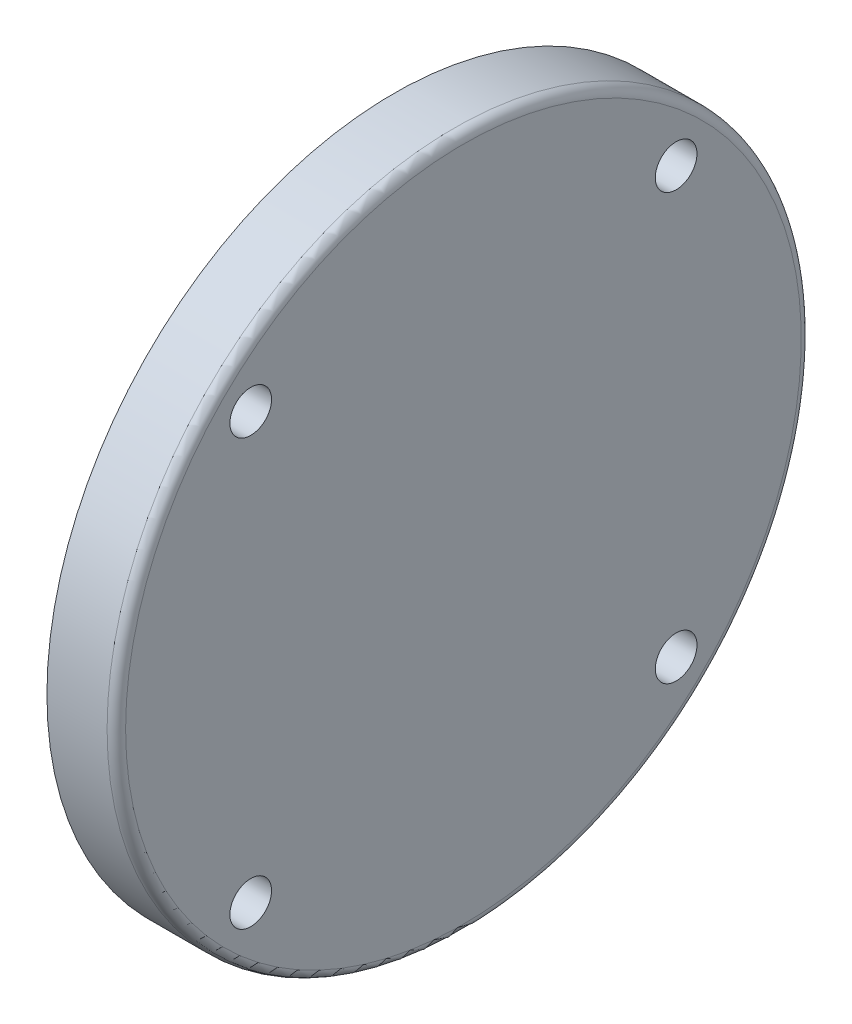
ISO-10303-21;
HEADER;
FILE_DESCRIPTION(('STEP AP214'),'2;1');
FILE_NAME('part.step','',(''),(''),'','','');
FILE_SCHEMA(('AUTOMOTIVE_DESIGN { 1 0 10303 214 1 1 1 1 }'));
ENDSEC;
DATA;
#1=APPLICATION_CONTEXT('core data for automotive mechanical design processes');
#2=APPLICATION_PROTOCOL_DEFINITION('international standard','automotive_design',2000,#1);
#3=PRODUCT_CONTEXT('',#1,'mechanical');
#4=PRODUCT('Part','Part','',(#3));
#5=PRODUCT_RELATED_PRODUCT_CATEGORY('part','',(#4));
#6=PRODUCT_DEFINITION_FORMATION('','',#4);
#7=PRODUCT_DEFINITION_CONTEXT('part definition',#1,'design');
#8=PRODUCT_DEFINITION('design','',#6,#7);
#9=PRODUCT_DEFINITION_SHAPE('','',#8);
#10=(LENGTH_UNIT() NAMED_UNIT(*) SI_UNIT(.MILLI.,.METRE.));
#11=(NAMED_UNIT(*) PLANE_ANGLE_UNIT() SI_UNIT($,.RADIAN.));
#12=(NAMED_UNIT(*) SI_UNIT($,.STERADIAN.) SOLID_ANGLE_UNIT());
#13=UNCERTAINTY_MEASURE_WITH_UNIT(LENGTH_MEASURE(1.E-05),#10,'distance_accuracy_value','');
#14=(GEOMETRIC_REPRESENTATION_CONTEXT(3) GLOBAL_UNCERTAINTY_ASSIGNED_CONTEXT((#13)) GLOBAL_UNIT_ASSIGNED_CONTEXT((#10,
#11,#12)) REPRESENTATION_CONTEXT('',''));
#15=CARTESIAN_POINT('',(0.,0.,0.));
#16=DIRECTION('',(0.,0.,1.));
#17=DIRECTION('',(1.,0.,0.));
#18=AXIS2_PLACEMENT_3D('',#15,#16,#17);
#19=CARTESIAN_POINT('',(13.,0.,0.));
#20=DIRECTION('',(1.,0.,0.));
#21=DIRECTION('',(0.,0.,-1.));
#22=AXIS2_PLACEMENT_3D('',#19,#20,#21);
#23=TOROIDAL_SURFACE('',#22,73.,2.);
#24=CARTESIAN_POINT('',(15.,0.,0.));
#25=DIRECTION('',(1.,0.,0.));
#26=DIRECTION('',(0.,0.,-1.));
#27=AXIS2_PLACEMENT_3D('',#24,#25,#26);
#28=CIRCLE('',#27,73.);
#29=CARTESIAN_POINT('',(15.,0.,73.));
#30=VERTEX_POINT('',#29);
#31=EDGE_CURVE('E136',#30,#30,#28,.T.);
#32=ORIENTED_EDGE('',*,*,#31,.F.);
#33=CARTESIAN_POINT('',(13.,0.,73.));
#34=DIRECTION('',(0.,-1.,0.));
#35=DIRECTION('',(0.,0.,1.));
#36=AXIS2_PLACEMENT_3D('',#33,#34,#35);
#37=CIRCLE('',#36,2.);
#38=CARTESIAN_POINT('',(13.,0.,75.));
#39=VERTEX_POINT('',#38);
#40=EDGE_CURVE('E11',#30,#39,#37,.T.);
#41=ORIENTED_EDGE('',*,*,#40,.T.);
#42=CARTESIAN_POINT('',(13.,0.,0.));
#43=DIRECTION('',(-1.,0.,0.));
#44=DIRECTION('',(0.,0.,-1.));
#45=AXIS2_PLACEMENT_3D('',#42,#43,#44);
#46=CIRCLE('',#45,75.);
#47=CARTESIAN_POINT('',(13.,0.,-75.));
#48=VERTEX_POINT('',#47);
#49=EDGE_CURVE('E126',#48,#39,#46,.T.);
#50=ORIENTED_EDGE('',*,*,#49,.F.);
#51=CARTESIAN_POINT('',(13.,0.,0.));
#52=DIRECTION('',(-1.,0.,0.));
#53=DIRECTION('',(0.,0.,-1.));
#54=AXIS2_PLACEMENT_3D('',#51,#52,#53);
#55=CIRCLE('',#54,75.);
#56=EDGE_CURVE('E121',#39,#48,#55,.T.);
#57=ORIENTED_EDGE('',*,*,#56,.F.);
#58=ORIENTED_EDGE('',*,*,#40,.F.);
#59=EDGE_LOOP('',(#32,#41,#50,#57,#58));
#60=FACE_BOUND('',#59,.T.);
#61=ADVANCED_FACE('F16',(#60),#23,.T.);
#62=CARTESIAN_POINT('',(0.,0.,0.));
#63=DIRECTION('',(1.,0.,0.));
#64=DIRECTION('',(0.,0.,-1.));
#65=AXIS2_PLACEMENT_3D('',#62,#63,#64);
#66=TOROIDAL_SURFACE('',#65,50.,5.);
#67=CARTESIAN_POINT('',(0.,0.,0.));
#68=DIRECTION('',(1.,0.,0.));
#69=DIRECTION('',(0.,0.,-1.));
#70=AXIS2_PLACEMENT_3D('',#67,#68,#69);
#71=CIRCLE('',#70,55.);
#72=CARTESIAN_POINT('',(0.,0.,55.));
#73=VERTEX_POINT('',#72);
#74=EDGE_CURVE('E148',#73,#73,#71,.T.);
#75=ORIENTED_EDGE('',*,*,#74,.F.);
#76=CARTESIAN_POINT('',(0.,0.,50.));
#77=DIRECTION('',(0.,1.,0.));
#78=DIRECTION('',(0.,0.,1.));
#79=AXIS2_PLACEMENT_3D('',#76,#77,#78);
#80=CIRCLE('',#79,5.);
#81=CARTESIAN_POINT('',(5.,0.,50.));
#82=VERTEX_POINT('',#81);
#83=EDGE_CURVE('E27',#73,#82,#80,.T.);
#84=ORIENTED_EDGE('',*,*,#83,.T.);
#85=CARTESIAN_POINT('',(5.,0.,0.));
#86=DIRECTION('',(-1.,0.,0.));
#87=DIRECTION('',(0.,0.,-1.));
#88=AXIS2_PLACEMENT_3D('',#85,#86,#87);
#89=CIRCLE('',#88,50.);
#90=EDGE_CURVE('E145',#82,#82,#89,.T.);
#91=ORIENTED_EDGE('',*,*,#90,.F.);
#92=ORIENTED_EDGE('',*,*,#83,.F.);
#93=EDGE_LOOP('',(#75,#84,#91,#92));
#94=FACE_BOUND('',#93,.T.);
#95=ADVANCED_FACE('F190',(#94),#66,.F.);
#96=CARTESIAN_POINT('',(15.,45.9619407771256,-45.9619407771256));
#97=DIRECTION('',(-1.,0.,0.));
#98=DIRECTION('',(0.,0.,1.));
#99=AXIS2_PLACEMENT_3D('',#96,#97,#98);
#100=CYLINDRICAL_SURFACE('',#99,4.5);
#101=CARTESIAN_POINT('',(15.,45.9619407771256,-45.9619407771256));
#102=DIRECTION('',(-1.,0.,0.));
#103=DIRECTION('',(0.,0.,1.));
#104=AXIS2_PLACEMENT_3D('',#101,#102,#103);
#105=CIRCLE('',#104,4.5);
#106=CARTESIAN_POINT('',(15.,45.9619407771256,-50.4619407771256));
#107=VERTEX_POINT('',#106);
#108=EDGE_CURVE('E131',#107,#107,#105,.T.);
#109=ORIENTED_EDGE('',*,*,#108,.F.);
#110=DIRECTION('',(-1.,0.,0.));
#111=VECTOR('',#110,1.);
#112=CARTESIAN_POINT('',(15.,45.9619407771256,-50.4619407771256));
#113=LINE('',#112,#111);
#114=CARTESIAN_POINT('',(0.,45.9619407771256,-50.4619407771256));
#115=VERTEX_POINT('',#114);
#116=EDGE_CURVE('E114',#107,#115,#113,.T.);
#117=ORIENTED_EDGE('',*,*,#116,.T.);
#118=CARTESIAN_POINT('',(0.,45.9619407771256,-45.9619407771256));
#119=DIRECTION('',(-1.,0.,0.));
#120=DIRECTION('',(0.,0.,-1.));
#121=AXIS2_PLACEMENT_3D('',#118,#119,#120);
#122=CIRCLE('',#121,4.5);
#123=EDGE_CURVE('E139',#115,#115,#122,.T.);
#124=ORIENTED_EDGE('',*,*,#123,.T.);
#125=ORIENTED_EDGE('',*,*,#116,.F.);
#126=EDGE_LOOP('',(#109,#117,#124,#125));
#127=FACE_BOUND('',#126,.T.);
#128=ADVANCED_FACE('F18',(#127),#100,.F.);
#129=CARTESIAN_POINT('',(15.,45.9619407771256,45.9619407771256));
#130=DIRECTION('',(-1.,0.,0.));
#131=DIRECTION('',(0.,0.,1.));
#132=AXIS2_PLACEMENT_3D('',#129,#130,#131);
#133=CYLINDRICAL_SURFACE('',#132,4.5);
#134=CARTESIAN_POINT('',(15.,45.9619407771256,45.9619407771256));
#135=DIRECTION('',(-1.,0.,0.));
#136=DIRECTION('',(0.,0.,1.));
#137=AXIS2_PLACEMENT_3D('',#134,#135,#136);
#138=CIRCLE('',#137,4.5);
#139=CARTESIAN_POINT('',(15.,45.9619407771256,41.4619407771256));
#140=VERTEX_POINT('',#139);
#141=EDGE_CURVE('E135',#140,#140,#138,.T.);
#142=ORIENTED_EDGE('',*,*,#141,.F.);
#143=DIRECTION('',(-1.,0.,0.));
#144=VECTOR('',#143,1.);
#145=CARTESIAN_POINT('',(15.,45.9619407771256,41.4619407771256));
#146=LINE('',#145,#144);
#147=CARTESIAN_POINT('',(0.,45.9619407771256,41.4619407771256));
#148=VERTEX_POINT('',#147);
#149=EDGE_CURVE('E108',#140,#148,#146,.T.);
#150=ORIENTED_EDGE('',*,*,#149,.T.);
#151=CARTESIAN_POINT('',(0.,45.9619407771256,45.9619407771256));
#152=DIRECTION('',(-1.,0.,0.));
#153=DIRECTION('',(0.,0.,-1.));
#154=AXIS2_PLACEMENT_3D('',#151,#152,#153);
#155=CIRCLE('',#154,4.5);
#156=EDGE_CURVE('E123',#148,#148,#155,.T.);
#157=ORIENTED_EDGE('',*,*,#156,.T.);
#158=ORIENTED_EDGE('',*,*,#149,.F.);
#159=EDGE_LOOP('',(#142,#150,#157,#158));
#160=FACE_BOUND('',#159,.T.);
#161=ADVANCED_FACE('F198',(#160),#133,.F.);
#162=CARTESIAN_POINT('',(15.,-45.9619407771256,45.9619407771256));
#163=DIRECTION('',(-1.,0.,0.));
#164=DIRECTION('',(0.,0.,1.));
#165=AXIS2_PLACEMENT_3D('',#162,#163,#164);
#166=CYLINDRICAL_SURFACE('',#165,4.5);
#167=CARTESIAN_POINT('',(15.,-45.9619407771256,45.9619407771256));
#168=DIRECTION('',(-1.,0.,0.));
#169=DIRECTION('',(0.,0.,1.));
#170=AXIS2_PLACEMENT_3D('',#167,#168,#169);
#171=CIRCLE('',#170,4.5);
#172=CARTESIAN_POINT('',(15.,-45.9619407771256,41.4619407771256));
#173=VERTEX_POINT('',#172);
#174=EDGE_CURVE('E106',#173,#173,#171,.T.);
#175=ORIENTED_EDGE('',*,*,#174,.F.);
#176=DIRECTION('',(-1.,0.,0.));
#177=VECTOR('',#176,1.);
#178=CARTESIAN_POINT('',(15.,-45.9619407771256,41.4619407771256));
#179=LINE('',#178,#177);
#180=CARTESIAN_POINT('',(0.,-45.9619407771256,41.4619407771256));
#181=VERTEX_POINT('',#180);
#182=EDGE_CURVE('E101',#173,#181,#179,.T.);
#183=ORIENTED_EDGE('',*,*,#182,.T.);
#184=CARTESIAN_POINT('',(0.,-45.9619407771256,45.9619407771256));
#185=DIRECTION('',(-1.,0.,0.));
#186=DIRECTION('',(0.,0.,-1.));
#187=AXIS2_PLACEMENT_3D('',#184,#185,#186);
#188=CIRCLE('',#187,4.5);
#189=EDGE_CURVE('E104',#181,#181,#188,.T.);
#190=ORIENTED_EDGE('',*,*,#189,.T.);
#191=ORIENTED_EDGE('',*,*,#182,.F.);
#192=EDGE_LOOP('',(#175,#183,#190,#191));
#193=FACE_BOUND('',#192,.T.);
#194=ADVANCED_FACE('F102',(#193),#166,.F.);
#195=CARTESIAN_POINT('',(15.,-45.9619407771256,-45.9619407771256));
#196=DIRECTION('',(-1.,0.,0.));
#197=DIRECTION('',(0.,0.,1.));
#198=AXIS2_PLACEMENT_3D('',#195,#196,#197);
#199=CYLINDRICAL_SURFACE('',#198,4.5);
#200=CARTESIAN_POINT('',(15.,-45.9619407771256,-45.9619407771256));
#201=DIRECTION('',(-1.,0.,0.));
#202=DIRECTION('',(0.,0.,1.));
#203=AXIS2_PLACEMENT_3D('',#200,#201,#202);
#204=CIRCLE('',#203,4.5);
#205=CARTESIAN_POINT('',(15.,-45.9619407771256,-50.4619407771256));
#206=VERTEX_POINT('',#205);
#207=EDGE_CURVE('E117',#206,#206,#204,.T.);
#208=ORIENTED_EDGE('',*,*,#207,.F.);
#209=DIRECTION('',(-1.,0.,0.));
#210=VECTOR('',#209,1.);
#211=CARTESIAN_POINT('',(15.,-45.9619407771256,-50.4619407771256));
#212=LINE('',#211,#210);
#213=CARTESIAN_POINT('',(0.,-45.9619407771256,-50.4619407771256));
#214=VERTEX_POINT('',#213);
#215=EDGE_CURVE('E41',#206,#214,#212,.T.);
#216=ORIENTED_EDGE('',*,*,#215,.T.);
#217=CARTESIAN_POINT('',(0.,-45.9619407771256,-45.9619407771256));
#218=DIRECTION('',(-1.,0.,0.));
#219=DIRECTION('',(0.,0.,-1.));
#220=AXIS2_PLACEMENT_3D('',#217,#218,#219);
#221=CIRCLE('',#220,4.5);
#222=EDGE_CURVE('E20',#214,#214,#221,.T.);
#223=ORIENTED_EDGE('',*,*,#222,.T.);
#224=ORIENTED_EDGE('',*,*,#215,.F.);
#225=EDGE_LOOP('',(#208,#216,#223,#224));
#226=FACE_BOUND('',#225,.T.);
#227=ADVANCED_FACE('F201',(#226),#199,.F.);
#228=CARTESIAN_POINT('',(15.,0.,0.));
#229=DIRECTION('',(1.,0.,0.));
#230=DIRECTION('',(0.,1.,0.));
#231=AXIS2_PLACEMENT_3D('',#228,#229,#230);
#232=PLANE('',#231);
#233=ORIENTED_EDGE('',*,*,#207,.T.);
#234=EDGE_LOOP('',(#233));
#235=FACE_BOUND('',#234,.T.);
#236=ORIENTED_EDGE('',*,*,#174,.T.);
#237=EDGE_LOOP('',(#236));
#238=FACE_BOUND('',#237,.T.);
#239=ORIENTED_EDGE('',*,*,#141,.T.);
#240=EDGE_LOOP('',(#239));
#241=FACE_BOUND('',#240,.T.);
#242=ORIENTED_EDGE('',*,*,#108,.T.);
#243=EDGE_LOOP('',(#242));
#244=FACE_BOUND('',#243,.T.);
#245=ORIENTED_EDGE('',*,*,#31,.T.);
#246=EDGE_LOOP('',(#245));
#247=FACE_BOUND('',#246,.T.);
#248=ADVANCED_FACE('F170',(#235,#238,#241,#244,#247),#232,.T.);
#249=CARTESIAN_POINT('',(5.,0.,0.));
#250=DIRECTION('',(1.,0.,0.));
#251=DIRECTION('',(0.,1.,0.));
#252=AXIS2_PLACEMENT_3D('',#249,#250,#251);
#253=PLANE('',#252);
#254=ORIENTED_EDGE('',*,*,#90,.T.);
#255=EDGE_LOOP('',(#254));
#256=FACE_BOUND('',#255,.T.);
#257=ADVANCED_FACE('F178',(#256),#253,.F.);
#258=CARTESIAN_POINT('',(0.,0.,0.));
#259=DIRECTION('',(1.,0.,0.));
#260=DIRECTION('',(0.,1.,0.));
#261=AXIS2_PLACEMENT_3D('',#258,#259,#260);
#262=PLANE('',#261);
#263=ORIENTED_EDGE('',*,*,#74,.T.);
#264=EDGE_LOOP('',(#263));
#265=FACE_BOUND('',#264,.T.);
#266=ORIENTED_EDGE('',*,*,#222,.F.);
#267=EDGE_LOOP('',(#266));
#268=FACE_BOUND('',#267,.T.);
#269=ORIENTED_EDGE('',*,*,#189,.F.);
#270=EDGE_LOOP('',(#269));
#271=FACE_BOUND('',#270,.T.);
#272=ORIENTED_EDGE('',*,*,#156,.F.);
#273=EDGE_LOOP('',(#272));
#274=FACE_BOUND('',#273,.T.);
#275=ORIENTED_EDGE('',*,*,#123,.F.);
#276=EDGE_LOOP('',(#275));
#277=FACE_BOUND('',#276,.T.);
#278=CARTESIAN_POINT('',(0.,0.,0.));
#279=DIRECTION('',(1.,0.,0.));
#280=DIRECTION('',(0.,0.,-1.));
#281=AXIS2_PLACEMENT_3D('',#278,#279,#280);
#282=CIRCLE('',#281,75.);
#283=CARTESIAN_POINT('',(0.,0.,-75.));
#284=VERTEX_POINT('',#283);
#285=EDGE_CURVE('E149',#284,#284,#282,.T.);
#286=ORIENTED_EDGE('',*,*,#285,.F.);
#287=EDGE_LOOP('',(#286));
#288=FACE_BOUND('',#287,.T.);
#289=ADVANCED_FACE('F176',(#265,#268,#271,#274,#277,#288),#262,.F.);
#290=CARTESIAN_POINT('',(5.,0.,0.));
#291=DIRECTION('',(-1.,0.,0.));
#292=DIRECTION('',(0.,0.,1.));
#293=AXIS2_PLACEMENT_3D('',#290,#291,#292);
#294=CYLINDRICAL_SURFACE('',#293,75.);
#295=ORIENTED_EDGE('',*,*,#285,.T.);
#296=DIRECTION('',(1.,0.,0.));
#297=VECTOR('',#296,1.);
#298=CARTESIAN_POINT('',(5.,0.,-75.));
#299=LINE('',#298,#297);
#300=EDGE_CURVE('E129',#284,#48,#299,.T.);
#301=ORIENTED_EDGE('',*,*,#300,.T.);
#302=ORIENTED_EDGE('',*,*,#49,.T.);
#303=ORIENTED_EDGE('',*,*,#56,.T.);
#304=ORIENTED_EDGE('',*,*,#300,.F.);
#305=EDGE_LOOP('',(#295,#301,#302,#303,#304));
#306=FACE_BOUND('',#305,.T.);
#307=ADVANCED_FACE('F173',(#306),#294,.T.);
#308=CLOSED_SHELL('',(#61,#95,#128,#161,#194,#227,#248,#257,#289,#307));
#309=MANIFOLD_SOLID_BREP('B1',#308);
#310=ADVANCED_BREP_SHAPE_REPRESENTATION('',(#18,#309),#14);
#311=SHAPE_DEFINITION_REPRESENTATION(#9,#310);
ENDSEC;
END-ISO-10303-21;
